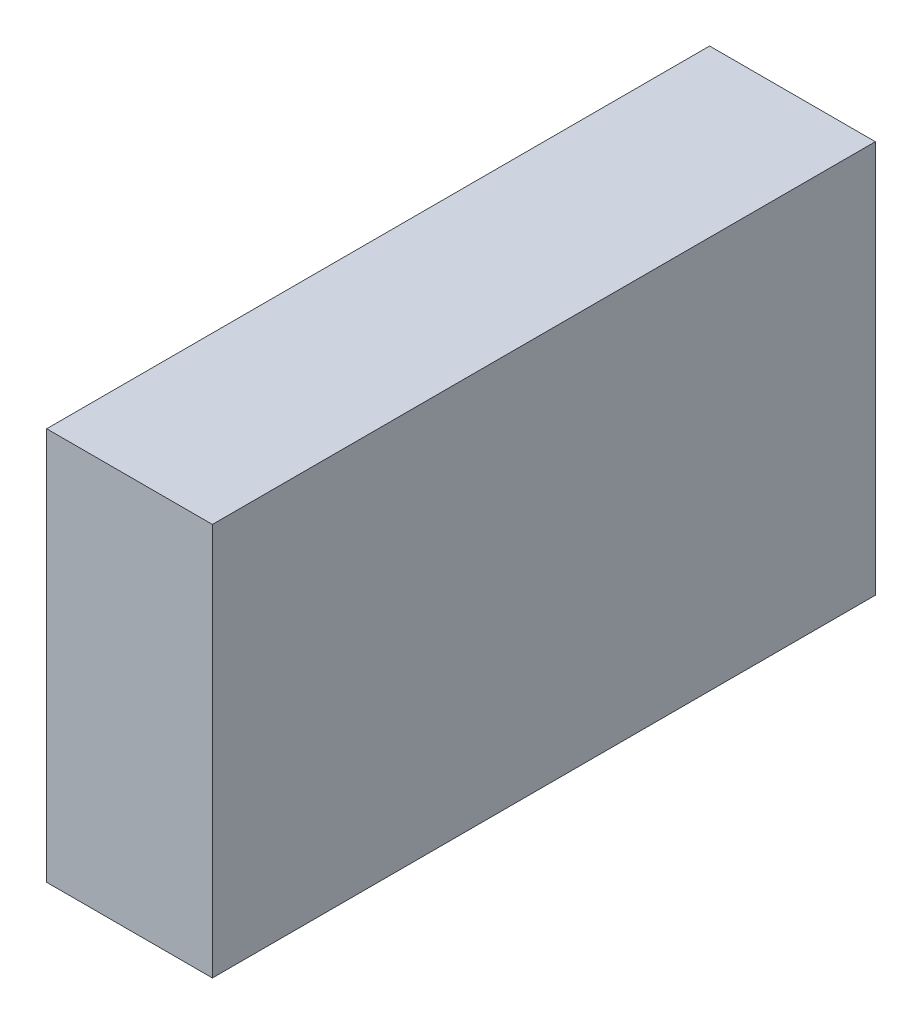
ISO-10303-21;
HEADER;
FILE_DESCRIPTION(('STEP AP214'),'2;1');
FILE_NAME('part.step','',(''),(''),'','','');
FILE_SCHEMA(('AUTOMOTIVE_DESIGN { 1 0 10303 214 1 1 1 1 }'));
ENDSEC;
DATA;
#1=APPLICATION_CONTEXT('core data for automotive mechanical design processes');
#2=APPLICATION_PROTOCOL_DEFINITION('international standard','automotive_design',2000,#1);
#3=PRODUCT_CONTEXT('',#1,'mechanical');
#4=PRODUCT('Part','Part','',(#3));
#5=PRODUCT_RELATED_PRODUCT_CATEGORY('part','',(#4));
#6=PRODUCT_DEFINITION_FORMATION('','',#4);
#7=PRODUCT_DEFINITION_CONTEXT('part definition',#1,'design');
#8=PRODUCT_DEFINITION('design','',#6,#7);
#9=PRODUCT_DEFINITION_SHAPE('','',#8);
#10=(LENGTH_UNIT() NAMED_UNIT(*) SI_UNIT(.MILLI.,.METRE.));
#11=(NAMED_UNIT(*) PLANE_ANGLE_UNIT() SI_UNIT($,.RADIAN.));
#12=(NAMED_UNIT(*) SI_UNIT($,.STERADIAN.) SOLID_ANGLE_UNIT());
#13=UNCERTAINTY_MEASURE_WITH_UNIT(LENGTH_MEASURE(1.E-05),#10,'distance_accuracy_value','');
#14=(GEOMETRIC_REPRESENTATION_CONTEXT(3) GLOBAL_UNCERTAINTY_ASSIGNED_CONTEXT((#13)) GLOBAL_UNIT_ASSIGNED_CONTEXT((#10,
#11,#12)) REPRESENTATION_CONTEXT('',''));
#15=CARTESIAN_POINT('',(0.,0.,0.));
#16=DIRECTION('',(0.,0.,1.));
#17=DIRECTION('',(1.,0.,0.));
#18=AXIS2_PLACEMENT_3D('',#15,#16,#17);
#19=CARTESIAN_POINT('',(-10.,0.,0.));
#20=DIRECTION('',(0.,0.,1.));
#21=DIRECTION('',(1.,0.,0.));
#22=AXIS2_PLACEMENT_3D('',#19,#20,#21);
#23=PLANE('',#22);
#24=DIRECTION('',(0.,-1.,0.));
#25=VECTOR('',#24,1.);
#26=CARTESIAN_POINT('',(0.,0.,0.));
#27=LINE('',#26,#25);
#28=CARTESIAN_POINT('',(0.,23.7,0.));
#29=VERTEX_POINT('',#28);
#30=CARTESIAN_POINT('',(0.,0.,0.));
#31=VERTEX_POINT('',#30);
#32=EDGE_CURVE('E107',#29,#31,#27,.T.);
#33=ORIENTED_EDGE('',*,*,#32,.F.);
#34=DIRECTION('',(1.,0.,0.));
#35=VECTOR('',#34,1.);
#36=CARTESIAN_POINT('',(-10.,23.7,0.));
#37=LINE('',#36,#35);
#38=CARTESIAN_POINT('',(-10.,23.7,0.));
#39=VERTEX_POINT('',#38);
#40=EDGE_CURVE('E11',#39,#29,#37,.T.);
#41=ORIENTED_EDGE('',*,*,#40,.F.);
#42=DIRECTION('',(0.,-1.,0.));
#43=VECTOR('',#42,1.);
#44=CARTESIAN_POINT('',(-10.,0.,0.));
#45=LINE('',#44,#43);
#46=CARTESIAN_POINT('',(-10.,0.,0.));
#47=VERTEX_POINT('',#46);
#48=EDGE_CURVE('E102',#39,#47,#45,.T.);
#49=ORIENTED_EDGE('',*,*,#48,.T.);
#50=DIRECTION('',(1.,0.,0.));
#51=VECTOR('',#50,1.);
#52=CARTESIAN_POINT('',(-10.,0.,0.));
#53=LINE('',#52,#51);
#54=EDGE_CURVE('E46',#47,#31,#53,.T.);
#55=ORIENTED_EDGE('',*,*,#54,.T.);
#56=EDGE_LOOP('',(#33,#41,#49,#55));
#57=FACE_BOUND('',#56,.T.);
#58=ADVANCED_FACE('F43',(#57),#23,.T.);
#59=CARTESIAN_POINT('',(-10.,23.7,0.));
#60=DIRECTION('',(0.,1.,0.));
#61=DIRECTION('',(0.,0.,1.));
#62=AXIS2_PLACEMENT_3D('',#59,#60,#61);
#63=PLANE('',#62);
#64=DIRECTION('',(0.,0.,1.));
#65=VECTOR('',#64,1.);
#66=CARTESIAN_POINT('',(0.,23.7,0.));
#67=LINE('',#66,#65);
#68=CARTESIAN_POINT('',(0.,23.7,-40.));
#69=VERTEX_POINT('',#68);
#70=EDGE_CURVE('E104',#69,#29,#67,.T.);
#71=ORIENTED_EDGE('',*,*,#70,.F.);
#72=DIRECTION('',(1.,0.,0.));
#73=VECTOR('',#72,1.);
#74=CARTESIAN_POINT('',(-10.,23.7,-40.));
#75=LINE('',#74,#73);
#76=CARTESIAN_POINT('',(-10.,23.7,-40.));
#77=VERTEX_POINT('',#76);
#78=EDGE_CURVE('E55',#77,#69,#75,.T.);
#79=ORIENTED_EDGE('',*,*,#78,.F.);
#80=DIRECTION('',(0.,0.,1.));
#81=VECTOR('',#80,1.);
#82=CARTESIAN_POINT('',(-10.,23.7,0.));
#83=LINE('',#82,#81);
#84=EDGE_CURVE('E97',#77,#39,#83,.T.);
#85=ORIENTED_EDGE('',*,*,#84,.T.);
#86=ORIENTED_EDGE('',*,*,#40,.T.);
#87=EDGE_LOOP('',(#71,#79,#85,#86));
#88=FACE_BOUND('',#87,.T.);
#89=ADVANCED_FACE('F117',(#88),#63,.T.);
#90=CARTESIAN_POINT('',(-10.,0.,-40.));
#91=DIRECTION('',(0.,0.,-1.));
#92=DIRECTION('',(-1.,0.,0.));
#93=AXIS2_PLACEMENT_3D('',#90,#91,#92);
#94=PLANE('',#93);
#95=DIRECTION('',(0.,1.,0.));
#96=VECTOR('',#95,1.);
#97=CARTESIAN_POINT('',(0.,0.,-40.));
#98=LINE('',#97,#96);
#99=CARTESIAN_POINT('',(0.,0.,-40.));
#100=VERTEX_POINT('',#99);
#101=EDGE_CURVE('E93',#100,#69,#98,.T.);
#102=ORIENTED_EDGE('',*,*,#101,.F.);
#103=DIRECTION('',(1.,0.,0.));
#104=VECTOR('',#103,1.);
#105=CARTESIAN_POINT('',(-10.,0.,-40.));
#106=LINE('',#105,#104);
#107=CARTESIAN_POINT('',(-10.,0.,-40.));
#108=VERTEX_POINT('',#107);
#109=EDGE_CURVE('E88',#108,#100,#106,.T.);
#110=ORIENTED_EDGE('',*,*,#109,.F.);
#111=DIRECTION('',(0.,1.,0.));
#112=VECTOR('',#111,1.);
#113=CARTESIAN_POINT('',(-10.,0.,-40.));
#114=LINE('',#113,#112);
#115=EDGE_CURVE('E91',#108,#77,#114,.T.);
#116=ORIENTED_EDGE('',*,*,#115,.T.);
#117=ORIENTED_EDGE('',*,*,#78,.T.);
#118=EDGE_LOOP('',(#102,#110,#116,#117));
#119=FACE_BOUND('',#118,.T.);
#120=ADVANCED_FACE('F89',(#119),#94,.T.);
#121=CARTESIAN_POINT('',(-10.,0.,0.));
#122=DIRECTION('',(0.,-1.,0.));
#123=DIRECTION('',(0.,0.,-1.));
#124=AXIS2_PLACEMENT_3D('',#121,#122,#123);
#125=PLANE('',#124);
#126=DIRECTION('',(0.,0.,-1.));
#127=VECTOR('',#126,1.);
#128=CARTESIAN_POINT('',(0.,0.,0.));
#129=LINE('',#128,#127);
#130=EDGE_CURVE('E110',#31,#100,#129,.T.);
#131=ORIENTED_EDGE('',*,*,#130,.F.);
#132=ORIENTED_EDGE('',*,*,#54,.F.);
#133=DIRECTION('',(0.,0.,-1.));
#134=VECTOR('',#133,1.);
#135=CARTESIAN_POINT('',(-10.,0.,0.));
#136=LINE('',#135,#134);
#137=EDGE_CURVE('E100',#47,#108,#136,.T.);
#138=ORIENTED_EDGE('',*,*,#137,.T.);
#139=ORIENTED_EDGE('',*,*,#109,.T.);
#140=EDGE_LOOP('',(#131,#132,#138,#139));
#141=FACE_BOUND('',#140,.T.);
#142=ADVANCED_FACE('F99',(#141),#125,.T.);
#143=CARTESIAN_POINT('',(-10.,0.,0.));
#144=DIRECTION('',(-1.,0.,0.));
#145=DIRECTION('',(0.,0.,1.));
#146=AXIS2_PLACEMENT_3D('',#143,#144,#145);
#147=PLANE('',#146);
#148=ORIENTED_EDGE('',*,*,#48,.F.);
#149=ORIENTED_EDGE('',*,*,#84,.F.);
#150=ORIENTED_EDGE('',*,*,#115,.F.);
#151=ORIENTED_EDGE('',*,*,#137,.F.);
#152=EDGE_LOOP('',(#148,#149,#150,#151));
#153=FACE_BOUND('',#152,.T.);
#154=ADVANCED_FACE('F96',(#153),#147,.T.);
#155=CARTESIAN_POINT('',(0.,0.,0.));
#156=DIRECTION('',(-1.,0.,0.));
#157=DIRECTION('',(0.,0.,1.));
#158=AXIS2_PLACEMENT_3D('',#155,#156,#157);
#159=PLANE('',#158);
#160=ORIENTED_EDGE('',*,*,#32,.T.);
#161=ORIENTED_EDGE('',*,*,#130,.T.);
#162=ORIENTED_EDGE('',*,*,#101,.T.);
#163=ORIENTED_EDGE('',*,*,#70,.T.);
#164=EDGE_LOOP('',(#160,#161,#162,#163));
#165=FACE_BOUND('',#164,.T.);
#166=ADVANCED_FACE('F116',(#165),#159,.F.);
#167=CLOSED_SHELL('',(#58,#89,#120,#142,#154,#166));
#168=MANIFOLD_SOLID_BREP('B2',#167);
#169=ADVANCED_BREP_SHAPE_REPRESENTATION('',(#18,#168),#14);
#170=SHAPE_DEFINITION_REPRESENTATION(#9,#169);
ENDSEC;
END-ISO-10303-21;
